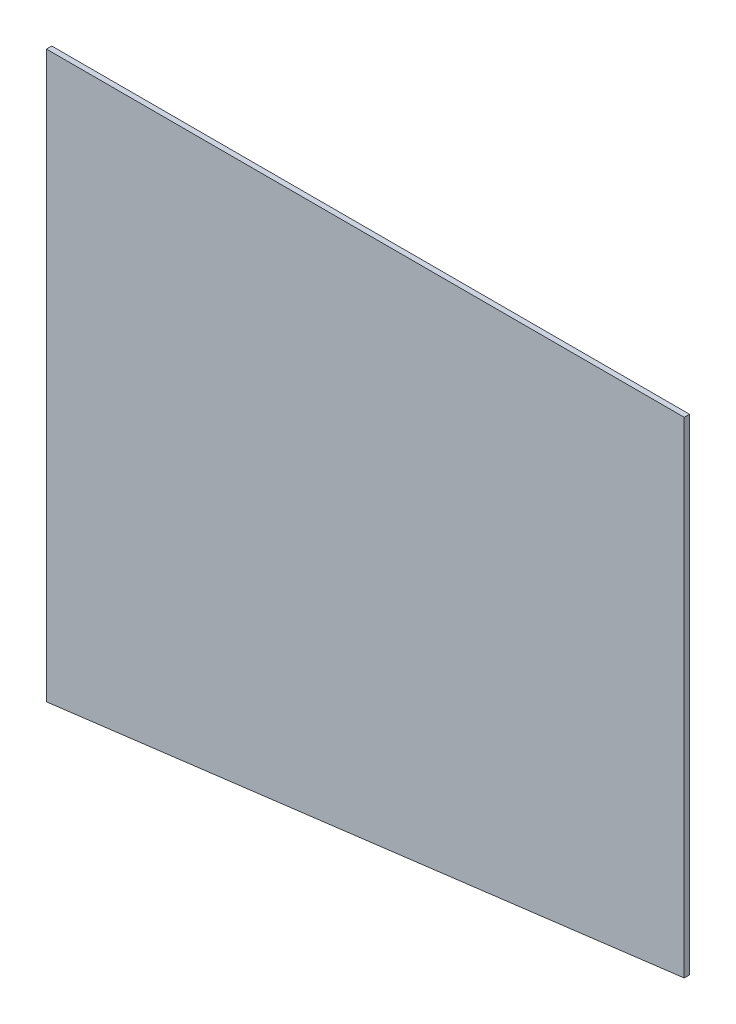
ISO-10303-21;
HEADER;
FILE_DESCRIPTION(('STEP AP214'),'2;1');
FILE_NAME('part.step','',(''),(''),'','','');
FILE_SCHEMA(('AUTOMOTIVE_DESIGN { 1 0 10303 214 1 1 1 1 }'));
ENDSEC;
DATA;
#1=APPLICATION_CONTEXT('core data for automotive mechanical design processes');
#2=APPLICATION_PROTOCOL_DEFINITION('international standard','automotive_design',2000,#1);
#3=PRODUCT_CONTEXT('',#1,'mechanical');
#4=PRODUCT('Part','Part','',(#3));
#5=PRODUCT_RELATED_PRODUCT_CATEGORY('part','',(#4));
#6=PRODUCT_DEFINITION_FORMATION('','',#4);
#7=PRODUCT_DEFINITION_CONTEXT('part definition',#1,'design');
#8=PRODUCT_DEFINITION('design','',#6,#7);
#9=PRODUCT_DEFINITION_SHAPE('','',#8);
#10=(LENGTH_UNIT() NAMED_UNIT(*) SI_UNIT(.MILLI.,.METRE.));
#11=(NAMED_UNIT(*) PLANE_ANGLE_UNIT() SI_UNIT($,.RADIAN.));
#12=(NAMED_UNIT(*) SI_UNIT($,.STERADIAN.) SOLID_ANGLE_UNIT());
#13=UNCERTAINTY_MEASURE_WITH_UNIT(LENGTH_MEASURE(1.E-05),#10,'distance_accuracy_value','');
#14=(GEOMETRIC_REPRESENTATION_CONTEXT(3) GLOBAL_UNCERTAINTY_ASSIGNED_CONTEXT((#13)) GLOBAL_UNIT_ASSIGNED_CONTEXT((#10,
#11,#12)) REPRESENTATION_CONTEXT('',''));
#15=CARTESIAN_POINT('',(0.,0.,0.));
#16=DIRECTION('',(0.,0.,1.));
#17=DIRECTION('',(1.,0.,0.));
#18=AXIS2_PLACEMENT_3D('',#15,#16,#17);
#19=CARTESIAN_POINT('',(-67.7142857142858,-163.234435562925,2.));
#20=DIRECTION('',(-0.124034734589208,0.992277876713668,0.));
#21=DIRECTION('',(-0.992277876713668,-0.124034734589208,0.));
#22=AXIS2_PLACEMENT_3D('',#19,#20,#21);
#23=PLANE('',#22);
#24=DIRECTION('',(0.992277876713668,0.124034734589208,0.));
#25=VECTOR('',#24,1.);
#26=CARTESIAN_POINT('',(-67.7142857142858,-163.234435562925,0.));
#27=LINE('',#26,#25);
#28=CARTESIAN_POINT('',(-67.7142857142858,-163.234435562925,0.));
#29=VERTEX_POINT('',#28);
#30=CARTESIAN_POINT('',(172.285714285714,-133.234435562925,0.));
#31=VERTEX_POINT('',#30);
#32=EDGE_CURVE('E96',#29,#31,#27,.T.);
#33=ORIENTED_EDGE('',*,*,#32,.T.);
#34=DIRECTION('',(0.,0.,-1.));
#35=VECTOR('',#34,1.);
#36=CARTESIAN_POINT('',(172.285714285714,-133.234435562925,2.));
#37=LINE('',#36,#35);
#38=CARTESIAN_POINT('',(172.285714285714,-133.234435562925,2.));
#39=VERTEX_POINT('',#38);
#40=EDGE_CURVE('E11',#39,#31,#37,.T.);
#41=ORIENTED_EDGE('',*,*,#40,.F.);
#42=DIRECTION('',(0.992277876713668,0.124034734589208,0.));
#43=VECTOR('',#42,1.);
#44=CARTESIAN_POINT('',(-67.7142857142858,-163.234435562925,2.));
#45=LINE('',#44,#43);
#46=CARTESIAN_POINT('',(-67.7142857142858,-163.234435562925,2.));
#47=VERTEX_POINT('',#46);
#48=EDGE_CURVE('E84',#47,#39,#45,.T.);
#49=ORIENTED_EDGE('',*,*,#48,.F.);
#50=DIRECTION('',(0.,0.,-1.));
#51=VECTOR('',#50,1.);
#52=CARTESIAN_POINT('',(-67.7142857142858,-163.234435562925,2.));
#53=LINE('',#52,#51);
#54=EDGE_CURVE('E92',#47,#29,#53,.T.);
#55=ORIENTED_EDGE('',*,*,#54,.T.);
#56=EDGE_LOOP('',(#33,#41,#49,#55));
#57=FACE_BOUND('',#56,.T.);
#58=ADVANCED_FACE('F33',(#57),#23,.F.);
#59=CARTESIAN_POINT('',(172.285714285714,-133.234435562925,2.));
#60=DIRECTION('',(-1.,0.,0.));
#61=DIRECTION('',(0.,-1.,0.));
#62=AXIS2_PLACEMENT_3D('',#59,#60,#61);
#63=PLANE('',#62);
#64=DIRECTION('',(0.,1.,0.));
#65=VECTOR('',#64,1.);
#66=CARTESIAN_POINT('',(172.285714285714,-133.234435562925,0.));
#67=LINE('',#66,#65);
#68=CARTESIAN_POINT('',(172.285714285714,49.4916164742418,0.));
#69=VERTEX_POINT('',#68);
#70=EDGE_CURVE('E88',#31,#69,#67,.T.);
#71=ORIENTED_EDGE('',*,*,#70,.T.);
#72=DIRECTION('',(0.,0.,-1.));
#73=VECTOR('',#72,1.);
#74=CARTESIAN_POINT('',(172.285714285714,49.4916164742418,2.));
#75=LINE('',#74,#73);
#76=CARTESIAN_POINT('',(172.285714285714,49.4916164742418,2.));
#77=VERTEX_POINT('',#76);
#78=EDGE_CURVE('E41',#77,#69,#75,.T.);
#79=ORIENTED_EDGE('',*,*,#78,.F.);
#80=DIRECTION('',(0.,1.,0.));
#81=VECTOR('',#80,1.);
#82=CARTESIAN_POINT('',(172.285714285714,-133.234435562925,2.));
#83=LINE('',#82,#81);
#84=EDGE_CURVE('E79',#39,#77,#83,.T.);
#85=ORIENTED_EDGE('',*,*,#84,.F.);
#86=ORIENTED_EDGE('',*,*,#40,.T.);
#87=EDGE_LOOP('',(#71,#79,#85,#86));
#88=FACE_BOUND('',#87,.T.);
#89=ADVANCED_FACE('F87',(#88),#63,.F.);
#90=CARTESIAN_POINT('',(172.285714285714,49.4916164742418,2.));
#91=DIRECTION('',(0.,-1.,0.));
#92=DIRECTION('',(0.,0.,-1.));
#93=AXIS2_PLACEMENT_3D('',#90,#91,#92);
#94=PLANE('',#93);
#95=DIRECTION('',(-1.,0.,0.));
#96=VECTOR('',#95,1.);
#97=CARTESIAN_POINT('',(172.285714285714,49.4916164742418,0.));
#98=LINE('',#97,#96);
#99=CARTESIAN_POINT('',(-67.7142857142858,49.4916164742418,0.));
#100=VERTEX_POINT('',#99);
#101=EDGE_CURVE('E66',#69,#100,#98,.T.);
#102=ORIENTED_EDGE('',*,*,#101,.T.);
#103=DIRECTION('',(0.,0.,-1.));
#104=VECTOR('',#103,1.);
#105=CARTESIAN_POINT('',(-67.7142857142858,49.4916164742418,2.));
#106=LINE('',#105,#104);
#107=CARTESIAN_POINT('',(-67.7142857142858,49.4916164742418,2.));
#108=VERTEX_POINT('',#107);
#109=EDGE_CURVE('E89',#108,#100,#106,.T.);
#110=ORIENTED_EDGE('',*,*,#109,.F.);
#111=DIRECTION('',(-1.,0.,0.));
#112=VECTOR('',#111,1.);
#113=CARTESIAN_POINT('',(172.285714285714,49.4916164742418,2.));
#114=LINE('',#113,#112);
#115=EDGE_CURVE('E82',#77,#108,#114,.T.);
#116=ORIENTED_EDGE('',*,*,#115,.F.);
#117=ORIENTED_EDGE('',*,*,#78,.T.);
#118=EDGE_LOOP('',(#102,#110,#116,#117));
#119=FACE_BOUND('',#118,.T.);
#120=ADVANCED_FACE('F90',(#119),#94,.F.);
#121=CARTESIAN_POINT('',(-67.7142857142858,49.4916164742418,2.));
#122=DIRECTION('',(1.,0.,0.));
#123=DIRECTION('',(0.,1.,0.));
#124=AXIS2_PLACEMENT_3D('',#121,#122,#123);
#125=PLANE('',#124);
#126=DIRECTION('',(0.,-1.,0.));
#127=VECTOR('',#126,1.);
#128=CARTESIAN_POINT('',(-67.7142857142858,49.4916164742418,0.));
#129=LINE('',#128,#127);
#130=EDGE_CURVE('E72',#100,#29,#129,.T.);
#131=ORIENTED_EDGE('',*,*,#130,.T.);
#132=ORIENTED_EDGE('',*,*,#54,.F.);
#133=DIRECTION('',(0.,-1.,0.));
#134=VECTOR('',#133,1.);
#135=CARTESIAN_POINT('',(-67.7142857142858,49.4916164742418,2.));
#136=LINE('',#135,#134);
#137=EDGE_CURVE('E49',#108,#47,#136,.T.);
#138=ORIENTED_EDGE('',*,*,#137,.F.);
#139=ORIENTED_EDGE('',*,*,#109,.T.);
#140=EDGE_LOOP('',(#131,#132,#138,#139));
#141=FACE_BOUND('',#140,.T.);
#142=ADVANCED_FACE('F103',(#141),#125,.F.);
#143=CARTESIAN_POINT('',(0.,0.,2.));
#144=DIRECTION('',(0.,0.,1.));
#145=DIRECTION('',(1.,0.,0.));
#146=AXIS2_PLACEMENT_3D('',#143,#144,#145);
#147=PLANE('',#146);
#148=ORIENTED_EDGE('',*,*,#48,.T.);
#149=ORIENTED_EDGE('',*,*,#84,.T.);
#150=ORIENTED_EDGE('',*,*,#115,.T.);
#151=ORIENTED_EDGE('',*,*,#137,.T.);
#152=EDGE_LOOP('',(#148,#149,#150,#151));
#153=FACE_BOUND('',#152,.T.);
#154=ADVANCED_FACE('F80',(#153),#147,.T.);
#155=CARTESIAN_POINT('',(0.,0.,0.));
#156=DIRECTION('',(0.,0.,1.));
#157=DIRECTION('',(1.,0.,0.));
#158=AXIS2_PLACEMENT_3D('',#155,#156,#157);
#159=PLANE('',#158);
#160=ORIENTED_EDGE('',*,*,#32,.F.);
#161=ORIENTED_EDGE('',*,*,#130,.F.);
#162=ORIENTED_EDGE('',*,*,#101,.F.);
#163=ORIENTED_EDGE('',*,*,#70,.F.);
#164=EDGE_LOOP('',(#160,#161,#162,#163));
#165=FACE_BOUND('',#164,.T.);
#166=ADVANCED_FACE('F106',(#165),#159,.F.);
#167=CLOSED_SHELL('',(#58,#89,#120,#142,#154,#166));
#168=MANIFOLD_SOLID_BREP('B2',#167);
#169=ADVANCED_BREP_SHAPE_REPRESENTATION('',(#18,#168),#14);
#170=SHAPE_DEFINITION_REPRESENTATION(#9,#169);
ENDSEC;
END-ISO-10303-21;
